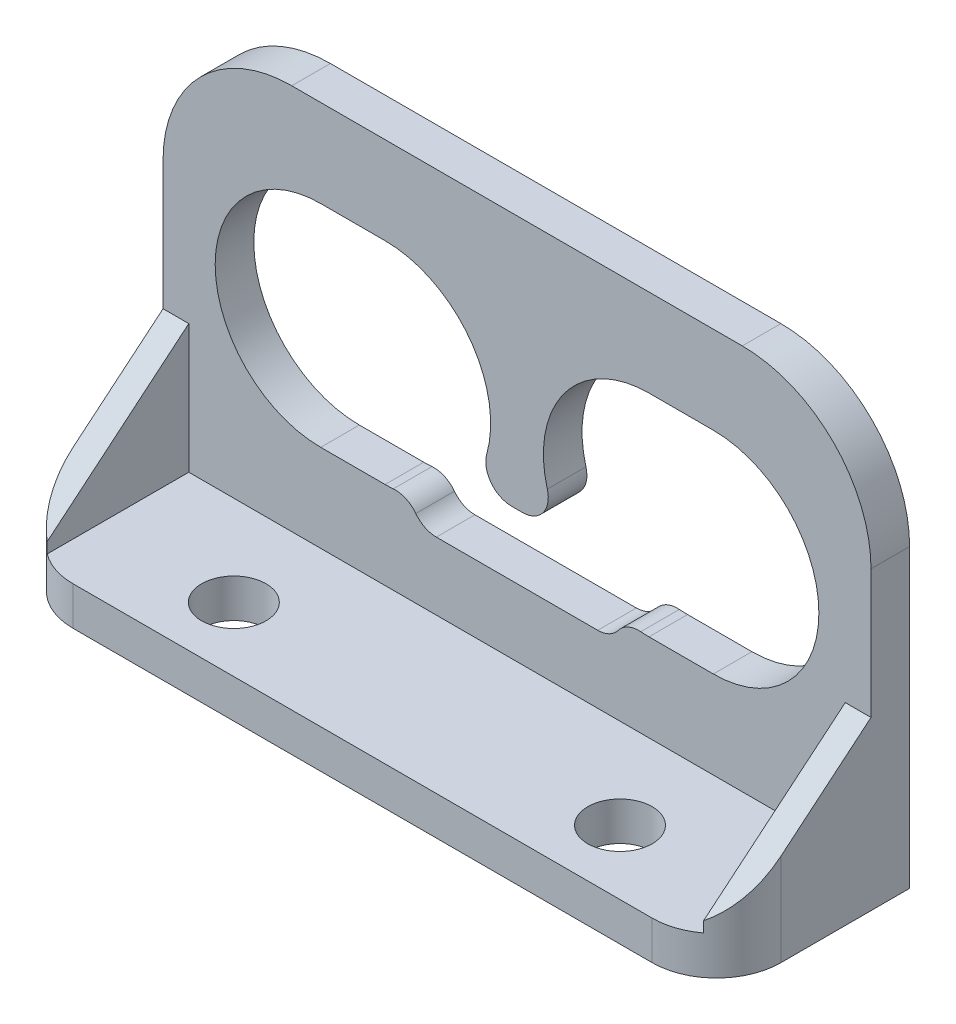
ISO-10303-21;
HEADER;
FILE_DESCRIPTION(('STEP AP214'),'2;1');
FILE_NAME('part.step','',(''),(''),'','','');
FILE_SCHEMA(('AUTOMOTIVE_DESIGN { 1 0 10303 214 1 1 1 1 }'));
ENDSEC;
DATA;
#1=APPLICATION_CONTEXT('core data for automotive mechanical design processes');
#2=APPLICATION_PROTOCOL_DEFINITION('international standard','automotive_design',2000,#1);
#3=PRODUCT_CONTEXT('',#1,'mechanical');
#4=PRODUCT('Part','Part','',(#3));
#5=PRODUCT_RELATED_PRODUCT_CATEGORY('part','',(#4));
#6=PRODUCT_DEFINITION_FORMATION('','',#4);
#7=PRODUCT_DEFINITION_CONTEXT('part definition',#1,'design');
#8=PRODUCT_DEFINITION('design','',#6,#7);
#9=PRODUCT_DEFINITION_SHAPE('','',#8);
#10=(LENGTH_UNIT() NAMED_UNIT(*) SI_UNIT(.MILLI.,.METRE.));
#11=(NAMED_UNIT(*) PLANE_ANGLE_UNIT() SI_UNIT($,.RADIAN.));
#12=(NAMED_UNIT(*) SI_UNIT($,.STERADIAN.) SOLID_ANGLE_UNIT());
#13=UNCERTAINTY_MEASURE_WITH_UNIT(LENGTH_MEASURE(1.E-05),#10,'distance_accuracy_value','');
#14=(GEOMETRIC_REPRESENTATION_CONTEXT(3) GLOBAL_UNCERTAINTY_ASSIGNED_CONTEXT((#13)) GLOBAL_UNIT_ASSIGNED_CONTEXT((#10,
#11,#12)) REPRESENTATION_CONTEXT('',''));
#15=CARTESIAN_POINT('',(0.,0.,0.));
#16=DIRECTION('',(0.,0.,1.));
#17=DIRECTION('',(1.,0.,0.));
#18=AXIS2_PLACEMENT_3D('',#15,#16,#17);
#19=CARTESIAN_POINT('',(10.25,18.,-34.5));
#20=DIRECTION('',(0.,0.,1.));
#21=DIRECTION('',(1.,0.,0.));
#22=AXIS2_PLACEMENT_3D('',#19,#20,#21);
#23=CYLINDRICAL_SURFACE('',#22,8.2);
#24=CARTESIAN_POINT('',(10.25,18.,-7.5));
#25=DIRECTION('',(0.,0.,1.));
#26=DIRECTION('',(1.,0.,0.));
#27=AXIS2_PLACEMENT_3D('',#24,#25,#26);
#28=CIRCLE('',#27,8.2);
#29=CARTESIAN_POINT('',(9.61137531752582,9.82490620757567,-7.5));
#30=VERTEX_POINT('',#29);
#31=CARTESIAN_POINT('',(10.25,9.8,-7.5));
#32=VERTEX_POINT('',#31);
#33=EDGE_CURVE('E510',#30,#32,#28,.T.);
#34=ORIENTED_EDGE('',*,*,#33,.F.);
#35=DIRECTION('',(0.,0.,1.));
#36=VECTOR('',#35,1.);
#37=CARTESIAN_POINT('',(9.61137531752582,9.82490620757567,-34.5));
#38=LINE('',#37,#36);
#39=CARTESIAN_POINT('',(9.61137531752582,9.82490620757567,-4.5));
#40=VERTEX_POINT('',#39);
#41=EDGE_CURVE('E342',#30,#40,#38,.T.);
#42=ORIENTED_EDGE('',*,*,#41,.T.);
#43=CARTESIAN_POINT('',(10.25,18.,-4.5));
#44=DIRECTION('',(0.,0.,1.));
#45=DIRECTION('',(-1.,0.,0.));
#46=AXIS2_PLACEMENT_3D('',#43,#44,#45);
#47=CIRCLE('',#46,8.2);
#48=CARTESIAN_POINT('',(10.25,9.8,-4.5));
#49=VERTEX_POINT('',#48);
#50=EDGE_CURVE('E492',#40,#49,#47,.T.);
#51=ORIENTED_EDGE('',*,*,#50,.T.);
#52=DIRECTION('',(0.,0.,1.));
#53=VECTOR('',#52,1.);
#54=CARTESIAN_POINT('',(10.25,9.8,-34.5));
#55=LINE('',#54,#53);
#56=EDGE_CURVE('E501',#32,#49,#55,.T.);
#57=ORIENTED_EDGE('',*,*,#56,.F.);
#58=EDGE_LOOP('',(#34,#42,#51,#57));
#59=FACE_BOUND('',#58,.T.);
#60=ADVANCED_FACE('F33',(#59),#23,.F.);
#61=CARTESIAN_POINT('',(-10.25,18.,-34.5));
#62=DIRECTION('',(0.,0.,1.));
#63=DIRECTION('',(1.,0.,0.));
#64=AXIS2_PLACEMENT_3D('',#61,#62,#63);
#65=CYLINDRICAL_SURFACE('',#64,8.2);
#66=CARTESIAN_POINT('',(-10.25,18.,-4.5));
#67=DIRECTION('',(0.,0.,1.));
#68=DIRECTION('',(1.,0.,0.));
#69=AXIS2_PLACEMENT_3D('',#66,#67,#68);
#70=CIRCLE('',#69,8.2);
#71=CARTESIAN_POINT('',(-10.25,9.8,-4.5));
#72=VERTEX_POINT('',#71);
#73=CARTESIAN_POINT('',(-9.61137531752582,9.82490620757567,-4.5));
#74=VERTEX_POINT('',#73);
#75=EDGE_CURVE('E471',#72,#74,#70,.T.);
#76=ORIENTED_EDGE('',*,*,#75,.T.);
#77=DIRECTION('',(0.,0.,1.));
#78=VECTOR('',#77,1.);
#79=CARTESIAN_POINT('',(-9.61137531752582,9.82490620757567,-34.5));
#80=LINE('',#79,#78);
#81=CARTESIAN_POINT('',(-9.61137531752582,9.82490620757567,-7.5));
#82=VERTEX_POINT('',#81);
#83=EDGE_CURVE('E329',#74,#82,#80,.F.);
#84=ORIENTED_EDGE('',*,*,#83,.T.);
#85=CARTESIAN_POINT('',(-10.25,18.,-7.5));
#86=DIRECTION('',(0.,0.,1.));
#87=DIRECTION('',(1.,0.,0.));
#88=AXIS2_PLACEMENT_3D('',#85,#86,#87);
#89=CIRCLE('',#88,8.2);
#90=CARTESIAN_POINT('',(-10.25,9.8,-7.5));
#91=VERTEX_POINT('',#90);
#92=EDGE_CURVE('E524',#91,#82,#89,.T.);
#93=ORIENTED_EDGE('',*,*,#92,.F.);
#94=DIRECTION('',(0.,0.,1.));
#95=VECTOR('',#94,1.);
#96=CARTESIAN_POINT('',(-10.25,9.8,-34.5));
#97=LINE('',#96,#95);
#98=EDGE_CURVE('E484',#91,#72,#97,.T.);
#99=ORIENTED_EDGE('',*,*,#98,.T.);
#100=EDGE_LOOP('',(#76,#84,#93,#99));
#101=FACE_BOUND('',#100,.T.);
#102=ADVANCED_FACE('F553',(#101),#65,.F.);
#103=CARTESIAN_POINT('',(0.,3.,0.));
#104=DIRECTION('',(0.,1.,0.));
#105=DIRECTION('',(0.,0.,1.));
#106=AXIS2_PLACEMENT_3D('',#103,#104,#105);
#107=PLANE('',#106);
#108=CARTESIAN_POINT('',(-15.,3.,2.5));
#109=DIRECTION('',(0.,1.,0.));
#110=DIRECTION('',(0.,0.,1.));
#111=AXIS2_PLACEMENT_3D('',#108,#109,#110);
#112=CIRCLE('',#111,2.5);
#113=CARTESIAN_POINT('',(-15.,3.,5.));
#114=VERTEX_POINT('',#113);
#115=EDGE_CURVE('E308',#114,#114,#112,.T.);
#116=ORIENTED_EDGE('',*,*,#115,.F.);
#117=EDGE_LOOP('',(#116));
#118=FACE_BOUND('',#117,.T.);
#119=CARTESIAN_POINT('',(15.,3.,2.5));
#120=DIRECTION('',(0.,1.,0.));
#121=DIRECTION('',(0.,0.,-1.));
#122=AXIS2_PLACEMENT_3D('',#119,#120,#121);
#123=CIRCLE('',#122,2.5);
#124=CARTESIAN_POINT('',(15.,3.,0.));
#125=VERTEX_POINT('',#124);
#126=EDGE_CURVE('E459',#125,#125,#123,.T.);
#127=ORIENTED_EDGE('',*,*,#126,.F.);
#128=EDGE_LOOP('',(#127));
#129=FACE_BOUND('',#128,.T.);
#130=DIRECTION('',(1.,0.,0.));
#131=VECTOR('',#130,1.);
#132=CARTESIAN_POINT('',(27.5,3.,7.49999999999999));
#133=LINE('',#132,#131);
#134=CARTESIAN_POINT('',(-22.5,3.,7.5));
#135=VERTEX_POINT('',#134);
#136=CARTESIAN_POINT('',(22.5,3.,7.5));
#137=VERTEX_POINT('',#136);
#138=EDGE_CURVE('E287',#135,#137,#133,.T.);
#139=ORIENTED_EDGE('',*,*,#138,.T.);
#140=CARTESIAN_POINT('',(22.5,3.,2.5));
#141=DIRECTION('',(0.,1.,0.));
#142=DIRECTION('',(0.,0.,1.));
#143=AXIS2_PLACEMENT_3D('',#140,#141,#142);
#144=CIRCLE('',#143,5.);
#145=CARTESIAN_POINT('',(25.5,3.,6.49999999999998));
#146=VERTEX_POINT('',#145);
#147=EDGE_CURVE('E262',#137,#146,#144,.T.);
#148=ORIENTED_EDGE('',*,*,#147,.T.);
#149=DIRECTION('',(0.,0.,1.));
#150=VECTOR('',#149,1.);
#151=CARTESIAN_POINT('',(25.5,3.,7.5));
#152=LINE('',#151,#150);
#153=CARTESIAN_POINT('',(25.5,3.,-4.5));
#154=VERTEX_POINT('',#153);
#155=EDGE_CURVE('E244',#154,#146,#152,.T.);
#156=ORIENTED_EDGE('',*,*,#155,.F.);
#157=DIRECTION('',(1.,0.,0.));
#158=VECTOR('',#157,1.);
#159=CARTESIAN_POINT('',(-27.5,3.,-4.5));
#160=LINE('',#159,#158);
#161=CARTESIAN_POINT('',(-25.5,3.,-4.5));
#162=VERTEX_POINT('',#161);
#163=EDGE_CURVE('E259',#162,#154,#160,.T.);
#164=ORIENTED_EDGE('',*,*,#163,.F.);
#165=DIRECTION('',(0.,0.,1.));
#166=VECTOR('',#165,1.);
#167=CARTESIAN_POINT('',(-25.5,3.,7.5));
#168=LINE('',#167,#166);
#169=CARTESIAN_POINT('',(-25.5,3.,6.5));
#170=VERTEX_POINT('',#169);
#171=EDGE_CURVE('E455',#162,#170,#168,.T.);
#172=ORIENTED_EDGE('',*,*,#171,.T.);
#173=CARTESIAN_POINT('',(-22.5,3.,2.5));
#174=DIRECTION('',(0.,1.,0.));
#175=DIRECTION('',(0.,0.,1.));
#176=AXIS2_PLACEMENT_3D('',#173,#174,#175);
#177=CIRCLE('',#176,5.);
#178=EDGE_CURVE('E393',#170,#135,#177,.T.);
#179=ORIENTED_EDGE('',*,*,#178,.T.);
#180=EDGE_LOOP('',(#139,#148,#156,#164,#172,#179));
#181=FACE_BOUND('',#180,.T.);
#182=ADVANCED_FACE('F257',(#118,#129,#181),#107,.T.);
#183=CARTESIAN_POINT('',(-27.5,33.,-4.5));
#184=DIRECTION('',(0.,0.,-1.));
#185=DIRECTION('',(-1.,0.,0.));
#186=AXIS2_PLACEMENT_3D('',#183,#184,#185);
#187=PLANE('',#186);
#188=DIRECTION('',(1.,0.,0.));
#189=VECTOR('',#188,1.);
#190=CARTESIAN_POINT('',(-27.5,13.25,-4.5));
#191=LINE('',#190,#189);
#192=CARTESIAN_POINT('',(-0.427703934415335,13.25,-4.5));
#193=VERTEX_POINT('',#192);
#194=CARTESIAN_POINT('',(0.427703934415335,13.25,-4.5));
#195=VERTEX_POINT('',#194);
#196=EDGE_CURVE('E571',#193,#195,#191,.T.);
#197=ORIENTED_EDGE('',*,*,#196,.T.);
#198=CARTESIAN_POINT('',(0.427703934415333,15.25,-4.5));
#199=DIRECTION('',(0.,0.,-1.));
#200=DIRECTION('',(-1.,0.,0.));
#201=AXIS2_PLACEMENT_3D('',#198,#199,#200);
#202=CIRCLE('',#201,2.);
#203=CARTESIAN_POINT('',(2.35364433943193,15.7892156862745,-4.5));
#204=VERTEX_POINT('',#203);
#205=EDGE_CURVE('E358',#195,#204,#202,.F.);
#206=ORIENTED_EDGE('',*,*,#205,.T.);
#207=CARTESIAN_POINT('',(10.25,26.2,-4.5));
#208=VERTEX_POINT('',#207);
#209=EDGE_CURVE('E493',#208,#204,#47,.T.);
#210=ORIENTED_EDGE('',*,*,#209,.F.);
#211=DIRECTION('',(-1.,0.,0.));
#212=VECTOR('',#211,1.);
#213=CARTESIAN_POINT('',(15.25,26.2,-4.5));
#214=LINE('',#213,#212);
#215=CARTESIAN_POINT('',(15.25,26.2,-4.5));
#216=VERTEX_POINT('',#215);
#217=EDGE_CURVE('E489',#216,#208,#214,.T.);
#218=ORIENTED_EDGE('',*,*,#217,.F.);
#219=CARTESIAN_POINT('',(15.25,18.,-4.5));
#220=DIRECTION('',(0.,0.,1.));
#221=DIRECTION('',(-1.,0.,0.));
#222=AXIS2_PLACEMENT_3D('',#219,#220,#221);
#223=CIRCLE('',#222,8.2);
#224=CARTESIAN_POINT('',(15.25,9.8,-4.5));
#225=VERTEX_POINT('',#224);
#226=EDGE_CURVE('E311',#225,#216,#223,.T.);
#227=ORIENTED_EDGE('',*,*,#226,.F.);
#228=DIRECTION('',(1.,0.,0.));
#229=VECTOR('',#228,1.);
#230=CARTESIAN_POINT('',(15.25,9.8,-4.5));
#231=LINE('',#230,#229);
#232=EDGE_CURVE('E496',#49,#225,#231,.T.);
#233=ORIENTED_EDGE('',*,*,#232,.F.);
#234=ORIENTED_EDGE('',*,*,#50,.F.);
#235=CARTESIAN_POINT('',(9.45561319984919,7.83098089235023,-4.5));
#236=DIRECTION('',(0.,0.,-1.));
#237=DIRECTION('',(-1.,0.,0.));
#238=AXIS2_PLACEMENT_3D('',#235,#236,#237);
#239=CIRCLE('',#238,2.);
#240=CARTESIAN_POINT('',(7.86278971960842,9.04049044617512,-4.5));
#241=VERTEX_POINT('',#240);
#242=EDGE_CURVE('E337',#40,#241,#239,.F.);
#243=ORIENTED_EDGE('',*,*,#242,.T.);
#244=CARTESIAN_POINT('',(6.26996623936765,10.25,-4.5));
#245=DIRECTION('',(0.,0.,-1.));
#246=DIRECTION('',(-1.,0.,0.));
#247=AXIS2_PLACEMENT_3D('',#244,#245,#246);
#248=CIRCLE('',#247,2.);
#249=CARTESIAN_POINT('',(6.26996623936765,8.25000000000001,-4.5));
#250=VERTEX_POINT('',#249);
#251=EDGE_CURVE('E379',#241,#250,#248,.T.);
#252=ORIENTED_EDGE('',*,*,#251,.T.);
#253=DIRECTION('',(-1.,0.,0.));
#254=VECTOR('',#253,1.);
#255=CARTESIAN_POINT('',(-27.5,8.25000000000001,-4.5));
#256=LINE('',#255,#254);
#257=CARTESIAN_POINT('',(-6.26996623936765,8.25000000000001,-4.5));
#258=VERTEX_POINT('',#257);
#259=EDGE_CURVE('E410',#250,#258,#256,.T.);
#260=ORIENTED_EDGE('',*,*,#259,.T.);
#261=CARTESIAN_POINT('',(-6.26996623936765,10.25,-4.5));
#262=DIRECTION('',(0.,0.,-1.));
#263=DIRECTION('',(-1.,0.,0.));
#264=AXIS2_PLACEMENT_3D('',#261,#262,#263);
#265=CIRCLE('',#264,2.);
#266=CARTESIAN_POINT('',(-7.86278971960842,9.04049044617512,-4.5));
#267=VERTEX_POINT('',#266);
#268=EDGE_CURVE('E375',#258,#267,#265,.T.);
#269=ORIENTED_EDGE('',*,*,#268,.T.);
#270=CARTESIAN_POINT('',(-9.45561319984919,7.83098089235023,-4.5));
#271=DIRECTION('',(0.,0.,-1.));
#272=DIRECTION('',(-1.,0.,0.));
#273=AXIS2_PLACEMENT_3D('',#270,#271,#272);
#274=CIRCLE('',#273,2.);
#275=EDGE_CURVE('E340',#267,#74,#274,.F.);
#276=ORIENTED_EDGE('',*,*,#275,.T.);
#277=ORIENTED_EDGE('',*,*,#75,.F.);
#278=DIRECTION('',(1.,0.,0.));
#279=VECTOR('',#278,1.);
#280=CARTESIAN_POINT('',(-15.25,9.8,-4.5));
#281=LINE('',#280,#279);
#282=CARTESIAN_POINT('',(-15.25,9.8,-4.5));
#283=VERTEX_POINT('',#282);
#284=EDGE_CURVE('E466',#283,#72,#281,.T.);
#285=ORIENTED_EDGE('',*,*,#284,.F.);
#286=CARTESIAN_POINT('',(-15.25,18.,-4.5));
#287=DIRECTION('',(0.,0.,1.));
#288=DIRECTION('',(1.,0.,0.));
#289=AXIS2_PLACEMENT_3D('',#286,#287,#288);
#290=CIRCLE('',#289,8.2);
#291=CARTESIAN_POINT('',(-15.25,26.2,-4.5));
#292=VERTEX_POINT('',#291);
#293=EDGE_CURVE('E464',#292,#283,#290,.T.);
#294=ORIENTED_EDGE('',*,*,#293,.F.);
#295=DIRECTION('',(-1.,0.,0.));
#296=VECTOR('',#295,1.);
#297=CARTESIAN_POINT('',(-15.25,26.2,-4.5));
#298=LINE('',#297,#296);
#299=CARTESIAN_POINT('',(-10.25,26.2,-4.5));
#300=VERTEX_POINT('',#299);
#301=EDGE_CURVE('E474',#300,#292,#298,.T.);
#302=ORIENTED_EDGE('',*,*,#301,.F.);
#303=CARTESIAN_POINT('',(-2.35364433943193,15.7892156862745,-4.5));
#304=VERTEX_POINT('',#303);
#305=EDGE_CURVE('E470',#304,#300,#70,.T.);
#306=ORIENTED_EDGE('',*,*,#305,.F.);
#307=CARTESIAN_POINT('',(-0.427703934415333,15.25,-4.5));
#308=DIRECTION('',(0.,0.,-1.));
#309=DIRECTION('',(-1.,0.,0.));
#310=AXIS2_PLACEMENT_3D('',#307,#308,#309);
#311=CIRCLE('',#310,2.);
#312=EDGE_CURVE('E356',#304,#193,#311,.F.);
#313=ORIENTED_EDGE('',*,*,#312,.T.);
#314=EDGE_LOOP('',(#197,#206,#210,#218,#227,#233,#234,#243,#252,#260,#269,#276,#277,#285,#294,
#302,#306,#313));
#315=FACE_BOUND('',#314,.T.);
#316=DIRECTION('',(0.,-1.,0.));
#317=VECTOR('',#316,1.);
#318=CARTESIAN_POINT('',(27.5,33.,-4.5));
#319=LINE('',#318,#317);
#320=CARTESIAN_POINT('',(27.5,23.,-4.5));
#321=VERTEX_POINT('',#320);
#322=CARTESIAN_POINT('',(27.5,13.,-4.5));
#323=VERTEX_POINT('',#322);
#324=EDGE_CURVE('E280',#321,#323,#319,.T.);
#325=ORIENTED_EDGE('',*,*,#324,.F.);
#326=CARTESIAN_POINT('',(17.5,23.,-4.5));
#327=DIRECTION('',(0.,0.,-1.));
#328=DIRECTION('',(-1.,0.,0.));
#329=AXIS2_PLACEMENT_3D('',#326,#327,#328);
#330=CIRCLE('',#329,10.);
#331=CARTESIAN_POINT('',(17.5,33.,-4.5));
#332=VERTEX_POINT('',#331);
#333=EDGE_CURVE('E325',#321,#332,#330,.F.);
#334=ORIENTED_EDGE('',*,*,#333,.T.);
#335=DIRECTION('',(1.,0.,0.));
#336=VECTOR('',#335,1.);
#337=CARTESIAN_POINT('',(-27.5,33.,-4.5));
#338=LINE('',#337,#336);
#339=CARTESIAN_POINT('',(-17.5,33.,-4.5));
#340=VERTEX_POINT('',#339);
#341=EDGE_CURVE('E269',#340,#332,#338,.T.);
#342=ORIENTED_EDGE('',*,*,#341,.F.);
#343=CARTESIAN_POINT('',(-17.5,23.,-4.5));
#344=DIRECTION('',(0.,0.,-1.));
#345=DIRECTION('',(-1.,0.,0.));
#346=AXIS2_PLACEMENT_3D('',#343,#344,#345);
#347=CIRCLE('',#346,10.);
#348=CARTESIAN_POINT('',(-27.5,23.,-4.5));
#349=VERTEX_POINT('',#348);
#350=EDGE_CURVE('E323',#340,#349,#347,.F.);
#351=ORIENTED_EDGE('',*,*,#350,.T.);
#352=DIRECTION('',(0.,-1.,0.));
#353=VECTOR('',#352,1.);
#354=CARTESIAN_POINT('',(-27.5,33.,-4.5));
#355=LINE('',#354,#353);
#356=CARTESIAN_POINT('',(-27.5,13.,-4.5));
#357=VERTEX_POINT('',#356);
#358=EDGE_CURVE('E283',#349,#357,#355,.T.);
#359=ORIENTED_EDGE('',*,*,#358,.T.);
#360=DIRECTION('',(-1.,0.,0.));
#361=VECTOR('',#360,1.);
#362=CARTESIAN_POINT('',(-25.5,13.,-4.5));
#363=LINE('',#362,#361);
#364=CARTESIAN_POINT('',(-25.5,13.,-4.5));
#365=VERTEX_POINT('',#364);
#366=EDGE_CURVE('E457',#365,#357,#363,.T.);
#367=ORIENTED_EDGE('',*,*,#366,.F.);
#368=DIRECTION('',(0.,-1.,0.));
#369=VECTOR('',#368,1.);
#370=CARTESIAN_POINT('',(-25.5,3.,-4.5));
#371=LINE('',#370,#369);
#372=EDGE_CURVE('E268',#365,#162,#371,.T.);
#373=ORIENTED_EDGE('',*,*,#372,.T.);
#374=ORIENTED_EDGE('',*,*,#163,.T.);
#375=DIRECTION('',(0.,-1.,0.));
#376=VECTOR('',#375,1.);
#377=CARTESIAN_POINT('',(25.5,3.,-4.5));
#378=LINE('',#377,#376);
#379=CARTESIAN_POINT('',(25.5,13.,-4.5));
#380=VERTEX_POINT('',#379);
#381=EDGE_CURVE('E241',#380,#154,#378,.T.);
#382=ORIENTED_EDGE('',*,*,#381,.F.);
#383=DIRECTION('',(1.,0.,0.));
#384=VECTOR('',#383,1.);
#385=CARTESIAN_POINT('',(25.5,13.,-4.5));
#386=LINE('',#385,#384);
#387=EDGE_CURVE('E252',#380,#323,#386,.T.);
#388=ORIENTED_EDGE('',*,*,#387,.T.);
#389=EDGE_LOOP('',(#325,#334,#342,#351,#359,#367,#373,#374,#382,#388));
#390=FACE_BOUND('',#389,.T.);
#391=ADVANCED_FACE('F265',(#315,#390),#187,.F.);
#392=CARTESIAN_POINT('',(-27.5,3.,7.5));
#393=DIRECTION('',(1.,0.,0.));
#394=DIRECTION('',(0.,0.,-1.));
#395=AXIS2_PLACEMENT_3D('',#392,#393,#394);
#396=PLANE('',#395);
#397=DIRECTION('',(0.,0.,1.));
#398=VECTOR('',#397,1.);
#399=CARTESIAN_POINT('',(-27.5,0.,7.5));
#400=LINE('',#399,#398);
#401=CARTESIAN_POINT('',(-27.5,0.,-7.5));
#402=VERTEX_POINT('',#401);
#403=CARTESIAN_POINT('',(-27.5,0.,2.5));
#404=VERTEX_POINT('',#403);
#405=EDGE_CURVE('E286',#402,#404,#400,.T.);
#406=ORIENTED_EDGE('',*,*,#405,.T.);
#407=DIRECTION('',(0.,-1.,0.));
#408=VECTOR('',#407,1.);
#409=CARTESIAN_POINT('',(-27.5,3.,2.5));
#410=LINE('',#409,#408);
#411=CARTESIAN_POINT('',(-27.5,7.16666666666667,2.5));
#412=VERTEX_POINT('',#411);
#413=EDGE_CURVE('E55',#404,#412,#410,.F.);
#414=ORIENTED_EDGE('',*,*,#413,.T.);
#415=DIRECTION('',(0.,0.64018439966448,-0.768221279597376));
#416=VECTOR('',#415,1.);
#417=CARTESIAN_POINT('',(-27.5,13.,-4.5));
#418=LINE('',#417,#416);
#419=EDGE_CURVE('E448',#412,#357,#418,.T.);
#420=ORIENTED_EDGE('',*,*,#419,.T.);
#421=ORIENTED_EDGE('',*,*,#358,.F.);
#422=DIRECTION('',(0.,0.,1.));
#423=VECTOR('',#422,1.);
#424=CARTESIAN_POINT('',(-27.5,23.,-7.5));
#425=LINE('',#424,#423);
#426=CARTESIAN_POINT('',(-27.5,23.,-7.5));
#427=VERTEX_POINT('',#426);
#428=EDGE_CURVE('E327',#349,#427,#425,.F.);
#429=ORIENTED_EDGE('',*,*,#428,.T.);
#430=DIRECTION('',(0.,-1.,0.));
#431=VECTOR('',#430,1.);
#432=CARTESIAN_POINT('',(-27.5,3.,-7.5));
#433=LINE('',#432,#431);
#434=EDGE_CURVE('E289',#427,#402,#433,.T.);
#435=ORIENTED_EDGE('',*,*,#434,.T.);
#436=EDGE_LOOP('',(#406,#414,#420,#421,#429,#435));
#437=FACE_BOUND('',#436,.T.);
#438=ADVANCED_FACE('F426',(#437),#396,.F.);
#439=CARTESIAN_POINT('',(27.5,3.,7.49999999999999));
#440=DIRECTION('',(0.,0.,-1.));
#441=DIRECTION('',(-1.,0.,0.));
#442=AXIS2_PLACEMENT_3D('',#439,#440,#441);
#443=PLANE('',#442);
#444=DIRECTION('',(1.,0.,0.));
#445=VECTOR('',#444,1.);
#446=CARTESIAN_POINT('',(27.5,0.,7.49999999999999));
#447=LINE('',#446,#445);
#448=CARTESIAN_POINT('',(-22.5,0.,7.5));
#449=VERTEX_POINT('',#448);
#450=CARTESIAN_POINT('',(22.5,0.,7.5));
#451=VERTEX_POINT('',#450);
#452=EDGE_CURVE('E292',#449,#451,#447,.T.);
#453=ORIENTED_EDGE('',*,*,#452,.T.);
#454=DIRECTION('',(0.,-1.,0.));
#455=VECTOR('',#454,1.);
#456=CARTESIAN_POINT('',(22.5,3.,7.5));
#457=LINE('',#456,#455);
#458=EDGE_CURVE('E391',#451,#137,#457,.F.);
#459=ORIENTED_EDGE('',*,*,#458,.T.);
#460=ORIENTED_EDGE('',*,*,#138,.F.);
#461=DIRECTION('',(0.,-1.,0.));
#462=VECTOR('',#461,1.);
#463=CARTESIAN_POINT('',(-22.5,3.,7.5));
#464=LINE('',#463,#462);
#465=EDGE_CURVE('E388',#135,#449,#464,.T.);
#466=ORIENTED_EDGE('',*,*,#465,.T.);
#467=EDGE_LOOP('',(#453,#459,#460,#466));
#468=FACE_BOUND('',#467,.T.);
#469=ADVANCED_FACE('F419',(#468),#443,.F.);
#470=CARTESIAN_POINT('',(27.5,3.,7.49999999999999));
#471=DIRECTION('',(-1.,0.,0.));
#472=DIRECTION('',(0.,0.,1.));
#473=AXIS2_PLACEMENT_3D('',#470,#471,#472);
#474=PLANE('',#473);
#475=DIRECTION('',(0.,0.64018439966448,-0.768221279597376));
#476=VECTOR('',#475,1.);
#477=CARTESIAN_POINT('',(27.5,13.,-4.5));
#478=LINE('',#477,#476);
#479=CARTESIAN_POINT('',(27.5,7.16666666666667,2.5));
#480=VERTEX_POINT('',#479);
#481=EDGE_CURVE('E404',#480,#323,#478,.T.);
#482=ORIENTED_EDGE('',*,*,#481,.F.);
#483=DIRECTION('',(0.,-1.,0.));
#484=VECTOR('',#483,1.);
#485=CARTESIAN_POINT('',(27.5,3.,2.5));
#486=LINE('',#485,#484);
#487=CARTESIAN_POINT('',(27.5,0.,2.5));
#488=VERTEX_POINT('',#487);
#489=EDGE_CURVE('E381',#480,#488,#486,.T.);
#490=ORIENTED_EDGE('',*,*,#489,.T.);
#491=DIRECTION('',(0.,0.,-1.));
#492=VECTOR('',#491,1.);
#493=CARTESIAN_POINT('',(27.5,0.,7.49999999999999));
#494=LINE('',#493,#492);
#495=CARTESIAN_POINT('',(27.5,0.,-7.50000000000001));
#496=VERTEX_POINT('',#495);
#497=EDGE_CURVE('E295',#488,#496,#494,.T.);
#498=ORIENTED_EDGE('',*,*,#497,.T.);
#499=DIRECTION('',(0.,-1.,0.));
#500=VECTOR('',#499,1.);
#501=CARTESIAN_POINT('',(27.5,3.,-7.50000000000001));
#502=LINE('',#501,#500);
#503=CARTESIAN_POINT('',(27.5,23.,-7.50000000000001));
#504=VERTEX_POINT('',#503);
#505=EDGE_CURVE('E300',#504,#496,#502,.T.);
#506=ORIENTED_EDGE('',*,*,#505,.F.);
#507=DIRECTION('',(0.,0.,-1.));
#508=VECTOR('',#507,1.);
#509=CARTESIAN_POINT('',(27.5,23.,-4.5));
#510=LINE('',#509,#508);
#511=EDGE_CURVE('E321',#504,#321,#510,.F.);
#512=ORIENTED_EDGE('',*,*,#511,.T.);
#513=ORIENTED_EDGE('',*,*,#324,.T.);
#514=EDGE_LOOP('',(#482,#490,#498,#506,#512,#513));
#515=FACE_BOUND('',#514,.T.);
#516=ADVANCED_FACE('F408',(#515),#474,.F.);
#517=CARTESIAN_POINT('',(27.5,3.,-7.50000000000001));
#518=DIRECTION('',(0.,0.,1.));
#519=DIRECTION('',(1.,0.,0.));
#520=AXIS2_PLACEMENT_3D('',#517,#518,#519);
#521=PLANE('',#520);
#522=CARTESIAN_POINT('',(10.25,26.2,-7.5));
#523=VERTEX_POINT('',#522);
#524=CARTESIAN_POINT('',(2.35364433943193,15.7892156862745,-7.5));
#525=VERTEX_POINT('',#524);
#526=EDGE_CURVE('E511',#523,#525,#28,.T.);
#527=ORIENTED_EDGE('',*,*,#526,.T.);
#528=CARTESIAN_POINT('',(0.427703934415333,15.25,-7.5));
#529=DIRECTION('',(0.,0.,1.));
#530=DIRECTION('',(1.,0.,0.));
#531=AXIS2_PLACEMENT_3D('',#528,#529,#530);
#532=CIRCLE('',#531,2.);
#533=CARTESIAN_POINT('',(0.427703934415332,13.25,-7.5));
#534=VERTEX_POINT('',#533);
#535=EDGE_CURVE('E350',#525,#534,#532,.F.);
#536=ORIENTED_EDGE('',*,*,#535,.T.);
#537=DIRECTION('',(1.,0.,0.));
#538=VECTOR('',#537,1.);
#539=CARTESIAN_POINT('',(-7.5,13.25,-7.5));
#540=LINE('',#539,#538);
#541=CARTESIAN_POINT('',(-0.427703934415333,13.25,-7.5));
#542=VERTEX_POINT('',#541);
#543=EDGE_CURVE('E572',#542,#534,#540,.T.);
#544=ORIENTED_EDGE('',*,*,#543,.F.);
#545=CARTESIAN_POINT('',(-0.427703934415333,15.25,-7.5));
#546=DIRECTION('',(0.,0.,1.));
#547=DIRECTION('',(1.,0.,0.));
#548=AXIS2_PLACEMENT_3D('',#545,#546,#547);
#549=CIRCLE('',#548,2.);
#550=CARTESIAN_POINT('',(-2.35364433943193,15.7892156862745,-7.5));
#551=VERTEX_POINT('',#550);
#552=EDGE_CURVE('E348',#542,#551,#549,.F.);
#553=ORIENTED_EDGE('',*,*,#552,.T.);
#554=CARTESIAN_POINT('',(-10.25,26.2,-7.5));
#555=VERTEX_POINT('',#554);
#556=EDGE_CURVE('E523',#551,#555,#89,.T.);
#557=ORIENTED_EDGE('',*,*,#556,.T.);
#558=DIRECTION('',(-1.,0.,0.));
#559=VECTOR('',#558,1.);
#560=CARTESIAN_POINT('',(27.5,26.2,-7.50000000000001));
#561=LINE('',#560,#559);
#562=CARTESIAN_POINT('',(-15.25,26.2,-7.5));
#563=VERTEX_POINT('',#562);
#564=EDGE_CURVE('E276',#555,#563,#561,.T.);
#565=ORIENTED_EDGE('',*,*,#564,.T.);
#566=CARTESIAN_POINT('',(-15.25,18.,-7.5));
#567=DIRECTION('',(0.,0.,1.));
#568=DIRECTION('',(1.,0.,0.));
#569=AXIS2_PLACEMENT_3D('',#566,#567,#568);
#570=CIRCLE('',#569,8.2);
#571=CARTESIAN_POINT('',(-15.25,9.8,-7.5));
#572=VERTEX_POINT('',#571);
#573=EDGE_CURVE('E270',#563,#572,#570,.T.);
#574=ORIENTED_EDGE('',*,*,#573,.T.);
#575=DIRECTION('',(1.,0.,0.));
#576=VECTOR('',#575,1.);
#577=CARTESIAN_POINT('',(27.5,9.8,-7.50000000000001));
#578=LINE('',#577,#576);
#579=EDGE_CURVE('E520',#572,#91,#578,.T.);
#580=ORIENTED_EDGE('',*,*,#579,.T.);
#581=ORIENTED_EDGE('',*,*,#92,.T.);
#582=CARTESIAN_POINT('',(-9.45561319984919,7.83098089235023,-7.5));
#583=DIRECTION('',(0.,0.,1.));
#584=DIRECTION('',(1.,0.,0.));
#585=AXIS2_PLACEMENT_3D('',#582,#583,#584);
#586=CIRCLE('',#585,2.);
#587=CARTESIAN_POINT('',(-7.86278971960842,9.04049044617512,-7.5));
#588=VERTEX_POINT('',#587);
#589=EDGE_CURVE('E334',#82,#588,#586,.F.);
#590=ORIENTED_EDGE('',*,*,#589,.T.);
#591=CARTESIAN_POINT('',(-6.26996623936765,10.25,-7.5));
#592=DIRECTION('',(0.,0.,1.));
#593=DIRECTION('',(1.,0.,0.));
#594=AXIS2_PLACEMENT_3D('',#591,#592,#593);
#595=CIRCLE('',#594,2.);
#596=CARTESIAN_POINT('',(-6.26996623936765,8.25000000000001,-7.5));
#597=VERTEX_POINT('',#596);
#598=EDGE_CURVE('E373',#588,#597,#595,.T.);
#599=ORIENTED_EDGE('',*,*,#598,.T.);
#600=DIRECTION('',(-1.,0.,0.));
#601=VECTOR('',#600,1.);
#602=CARTESIAN_POINT('',(-7.5,8.25000000000001,-7.5));
#603=LINE('',#602,#601);
#604=CARTESIAN_POINT('',(6.26996623936765,8.25,-7.5));
#605=VERTEX_POINT('',#604);
#606=EDGE_CURVE('E565',#605,#597,#603,.T.);
#607=ORIENTED_EDGE('',*,*,#606,.F.);
#608=CARTESIAN_POINT('',(6.26996623936765,10.25,-7.5));
#609=DIRECTION('',(0.,0.,1.));
#610=DIRECTION('',(1.,0.,0.));
#611=AXIS2_PLACEMENT_3D('',#608,#609,#610);
#612=CIRCLE('',#611,2.);
#613=CARTESIAN_POINT('',(7.86278971960842,9.04049044617512,-7.5));
#614=VERTEX_POINT('',#613);
#615=EDGE_CURVE('E377',#605,#614,#612,.T.);
#616=ORIENTED_EDGE('',*,*,#615,.T.);
#617=CARTESIAN_POINT('',(9.45561319984919,7.83098089235023,-7.5));
#618=DIRECTION('',(0.,0.,1.));
#619=DIRECTION('',(1.,0.,0.));
#620=AXIS2_PLACEMENT_3D('',#617,#618,#619);
#621=CIRCLE('',#620,2.);
#622=EDGE_CURVE('E332',#614,#30,#621,.F.);
#623=ORIENTED_EDGE('',*,*,#622,.T.);
#624=ORIENTED_EDGE('',*,*,#33,.T.);
#625=DIRECTION('',(1.,0.,0.));
#626=VECTOR('',#625,1.);
#627=CARTESIAN_POINT('',(27.5,9.8,-7.50000000000001));
#628=LINE('',#627,#626);
#629=CARTESIAN_POINT('',(15.25,9.8,-7.5));
#630=VERTEX_POINT('',#629);
#631=EDGE_CURVE('E514',#32,#630,#628,.T.);
#632=ORIENTED_EDGE('',*,*,#631,.T.);
#633=CARTESIAN_POINT('',(15.25,18.,-7.50000000000001));
#634=DIRECTION('',(0.,0.,1.));
#635=DIRECTION('',(1.,0.,0.));
#636=AXIS2_PLACEMENT_3D('',#633,#634,#635);
#637=CIRCLE('',#636,8.2);
#638=CARTESIAN_POINT('',(15.25,26.2,-7.5));
#639=VERTEX_POINT('',#638);
#640=EDGE_CURVE('E517',#630,#639,#637,.T.);
#641=ORIENTED_EDGE('',*,*,#640,.T.);
#642=DIRECTION('',(-1.,0.,0.));
#643=VECTOR('',#642,1.);
#644=CARTESIAN_POINT('',(27.5,26.2,-7.50000000000001));
#645=LINE('',#644,#643);
#646=EDGE_CURVE('E480',#639,#523,#645,.T.);
#647=ORIENTED_EDGE('',*,*,#646,.T.);
#648=EDGE_LOOP('',(#527,#536,#544,#553,#557,#565,#574,#580,#581,#590,#599,#607,#616,#623,#624,
#632,#641,#647));
#649=FACE_BOUND('',#648,.T.);
#650=DIRECTION('',(-1.,0.,0.));
#651=VECTOR('',#650,1.);
#652=CARTESIAN_POINT('',(-27.5,33.,-7.5));
#653=LINE('',#652,#651);
#654=CARTESIAN_POINT('',(17.5,33.,-7.5));
#655=VERTEX_POINT('',#654);
#656=CARTESIAN_POINT('',(-17.5,33.,-7.5));
#657=VERTEX_POINT('',#656);
#658=EDGE_CURVE('E273',#655,#657,#653,.T.);
#659=ORIENTED_EDGE('',*,*,#658,.F.);
#660=CARTESIAN_POINT('',(17.5,23.,-7.5));
#661=DIRECTION('',(0.,0.,1.));
#662=DIRECTION('',(1.,0.,0.));
#663=AXIS2_PLACEMENT_3D('',#660,#661,#662);
#664=CIRCLE('',#663,10.);
#665=EDGE_CURVE('E319',#655,#504,#664,.F.);
#666=ORIENTED_EDGE('',*,*,#665,.T.);
#667=ORIENTED_EDGE('',*,*,#505,.T.);
#668=DIRECTION('',(-1.,0.,0.));
#669=VECTOR('',#668,1.);
#670=CARTESIAN_POINT('',(27.5,0.,-7.50000000000001));
#671=LINE('',#670,#669);
#672=EDGE_CURVE('E290',#496,#402,#671,.T.);
#673=ORIENTED_EDGE('',*,*,#672,.T.);
#674=ORIENTED_EDGE('',*,*,#434,.F.);
#675=CARTESIAN_POINT('',(-17.5,23.,-7.5));
#676=DIRECTION('',(0.,0.,1.));
#677=DIRECTION('',(1.,0.,0.));
#678=AXIS2_PLACEMENT_3D('',#675,#676,#677);
#679=CIRCLE('',#678,10.);
#680=EDGE_CURVE('E317',#427,#657,#679,.F.);
#681=ORIENTED_EDGE('',*,*,#680,.T.);
#682=EDGE_LOOP('',(#659,#666,#667,#673,#674,#681));
#683=FACE_BOUND('',#682,.T.);
#684=ADVANCED_FACE('F433',(#649,#683),#521,.F.);
#685=CARTESIAN_POINT('',(0.,0.,0.));
#686=DIRECTION('',(0.,1.,0.));
#687=DIRECTION('',(0.,0.,1.));
#688=AXIS2_PLACEMENT_3D('',#685,#686,#687);
#689=PLANE('',#688);
#690=CARTESIAN_POINT('',(-15.,0.,2.5));
#691=DIRECTION('',(0.,1.,0.));
#692=DIRECTION('',(0.,0.,1.));
#693=AXIS2_PLACEMENT_3D('',#690,#691,#692);
#694=CIRCLE('',#693,2.5);
#695=CARTESIAN_POINT('',(-15.,0.,5.));
#696=VERTEX_POINT('',#695);
#697=EDGE_CURVE('E307',#696,#696,#694,.T.);
#698=ORIENTED_EDGE('',*,*,#697,.T.);
#699=EDGE_LOOP('',(#698));
#700=FACE_BOUND('',#699,.T.);
#701=CARTESIAN_POINT('',(15.,0.,2.5));
#702=DIRECTION('',(0.,1.,0.));
#703=DIRECTION('',(0.,0.,1.));
#704=AXIS2_PLACEMENT_3D('',#701,#702,#703);
#705=CIRCLE('',#704,2.5);
#706=CARTESIAN_POINT('',(15.,0.,5.));
#707=VERTEX_POINT('',#706);
#708=EDGE_CURVE('E304',#707,#707,#705,.T.);
#709=ORIENTED_EDGE('',*,*,#708,.T.);
#710=EDGE_LOOP('',(#709));
#711=FACE_BOUND('',#710,.T.);
#712=ORIENTED_EDGE('',*,*,#497,.F.);
#713=CARTESIAN_POINT('',(22.5,0.,2.5));
#714=DIRECTION('',(0.,1.,0.));
#715=DIRECTION('',(0.,0.,1.));
#716=AXIS2_PLACEMENT_3D('',#713,#714,#715);
#717=CIRCLE('',#716,5.);
#718=EDGE_CURVE('E386',#488,#451,#717,.F.);
#719=ORIENTED_EDGE('',*,*,#718,.T.);
#720=ORIENTED_EDGE('',*,*,#452,.F.);
#721=CARTESIAN_POINT('',(-22.5,0.,2.5));
#722=DIRECTION('',(0.,1.,0.));
#723=DIRECTION('',(0.,0.,1.));
#724=AXIS2_PLACEMENT_3D('',#721,#722,#723);
#725=CIRCLE('',#724,5.);
#726=EDGE_CURVE('E384',#449,#404,#725,.F.);
#727=ORIENTED_EDGE('',*,*,#726,.T.);
#728=ORIENTED_EDGE('',*,*,#405,.F.);
#729=ORIENTED_EDGE('',*,*,#672,.F.);
#730=EDGE_LOOP('',(#712,#719,#720,#727,#728,#729));
#731=FACE_BOUND('',#730,.T.);
#732=ADVANCED_FACE('F416',(#700,#711,#731),#689,.F.);
#733=CARTESIAN_POINT('',(0.,33.,0.));
#734=DIRECTION('',(0.,1.,0.));
#735=DIRECTION('',(0.,0.,1.));
#736=AXIS2_PLACEMENT_3D('',#733,#734,#735);
#737=PLANE('',#736);
#738=ORIENTED_EDGE('',*,*,#341,.T.);
#739=DIRECTION('',(0.,0.,-1.));
#740=VECTOR('',#739,1.);
#741=CARTESIAN_POINT('',(17.5,33.,-7.5));
#742=LINE('',#741,#740);
#743=EDGE_CURVE('E314',#332,#655,#742,.T.);
#744=ORIENTED_EDGE('',*,*,#743,.T.);
#745=ORIENTED_EDGE('',*,*,#658,.T.);
#746=DIRECTION('',(0.,0.,1.));
#747=VECTOR('',#746,1.);
#748=CARTESIAN_POINT('',(-17.5,33.,-4.5));
#749=LINE('',#748,#747);
#750=EDGE_CURVE('E303',#657,#340,#749,.T.);
#751=ORIENTED_EDGE('',*,*,#750,.T.);
#752=EDGE_LOOP('',(#738,#744,#745,#751));
#753=FACE_BOUND('',#752,.T.);
#754=ADVANCED_FACE('F442',(#753),#737,.T.);
#755=CARTESIAN_POINT('',(15.25,18.,-34.5));
#756=DIRECTION('',(0.,0.,1.));
#757=DIRECTION('',(1.,0.,0.));
#758=AXIS2_PLACEMENT_3D('',#755,#756,#757);
#759=CYLINDRICAL_SURFACE('',#758,8.2);
#760=DIRECTION('',(0.,0.,1.));
#761=VECTOR('',#760,1.);
#762=CARTESIAN_POINT('',(15.25,9.8,-34.5));
#763=LINE('',#762,#761);
#764=EDGE_CURVE('E467',#630,#225,#763,.T.);
#765=ORIENTED_EDGE('',*,*,#764,.T.);
#766=ORIENTED_EDGE('',*,*,#226,.T.);
#767=DIRECTION('',(0.,0.,1.));
#768=VECTOR('',#767,1.);
#769=CARTESIAN_POINT('',(15.25,26.2,-34.5));
#770=LINE('',#769,#768);
#771=EDGE_CURVE('E499',#639,#216,#770,.T.);
#772=ORIENTED_EDGE('',*,*,#771,.F.);
#773=ORIENTED_EDGE('',*,*,#640,.F.);
#774=EDGE_LOOP('',(#765,#766,#772,#773));
#775=FACE_BOUND('',#774,.T.);
#776=ADVANCED_FACE('F614',(#775),#759,.F.);
#777=CARTESIAN_POINT('',(15.25,9.8,-34.5));
#778=DIRECTION('',(0.,-1.,0.));
#779=DIRECTION('',(0.,0.,-1.));
#780=AXIS2_PLACEMENT_3D('',#777,#778,#779);
#781=PLANE('',#780);
#782=ORIENTED_EDGE('',*,*,#56,.T.);
#783=ORIENTED_EDGE('',*,*,#232,.T.);
#784=ORIENTED_EDGE('',*,*,#764,.F.);
#785=ORIENTED_EDGE('',*,*,#631,.F.);
#786=EDGE_LOOP('',(#782,#783,#784,#785));
#787=FACE_BOUND('',#786,.T.);
#788=ADVANCED_FACE('F607',(#787),#781,.F.);
#789=ORIENTED_EDGE('',*,*,#209,.T.);
#790=DIRECTION('',(0.,0.,1.));
#791=VECTOR('',#790,1.);
#792=CARTESIAN_POINT('',(2.35364433943193,15.7892156862745,-34.5));
#793=LINE('',#792,#791);
#794=EDGE_CURVE('E345',#204,#525,#793,.F.);
#795=ORIENTED_EDGE('',*,*,#794,.T.);
#796=ORIENTED_EDGE('',*,*,#526,.F.);
#797=DIRECTION('',(0.,0.,1.));
#798=VECTOR('',#797,1.);
#799=CARTESIAN_POINT('',(10.25,26.2,-34.5));
#800=LINE('',#799,#798);
#801=EDGE_CURVE('E504',#523,#208,#800,.T.);
#802=ORIENTED_EDGE('',*,*,#801,.T.);
#803=EDGE_LOOP('',(#789,#795,#796,#802));
#804=FACE_BOUND('',#803,.T.);
#805=ADVANCED_FACE('F597',(#804),#23,.F.);
#806=CARTESIAN_POINT('',(15.25,26.2,-34.5));
#807=DIRECTION('',(0.,1.,0.));
#808=DIRECTION('',(0.,0.,1.));
#809=AXIS2_PLACEMENT_3D('',#806,#807,#808);
#810=PLANE('',#809);
#811=ORIENTED_EDGE('',*,*,#771,.T.);
#812=ORIENTED_EDGE('',*,*,#217,.T.);
#813=ORIENTED_EDGE('',*,*,#801,.F.);
#814=ORIENTED_EDGE('',*,*,#646,.F.);
#815=EDGE_LOOP('',(#811,#812,#813,#814));
#816=FACE_BOUND('',#815,.T.);
#817=ADVANCED_FACE('F606',(#816),#810,.F.);
#818=CARTESIAN_POINT('',(-15.25,18.,-34.5));
#819=DIRECTION('',(0.,0.,1.));
#820=DIRECTION('',(1.,0.,0.));
#821=AXIS2_PLACEMENT_3D('',#818,#819,#820);
#822=CYLINDRICAL_SURFACE('',#821,8.2);
#823=DIRECTION('',(0.,0.,1.));
#824=VECTOR('',#823,1.);
#825=CARTESIAN_POINT('',(-15.25,26.2,-34.5));
#826=LINE('',#825,#824);
#827=EDGE_CURVE('E478',#563,#292,#826,.T.);
#828=ORIENTED_EDGE('',*,*,#827,.T.);
#829=ORIENTED_EDGE('',*,*,#293,.T.);
#830=DIRECTION('',(0.,0.,1.));
#831=VECTOR('',#830,1.);
#832=CARTESIAN_POINT('',(-15.25,9.8,-34.5));
#833=LINE('',#832,#831);
#834=EDGE_CURVE('E477',#572,#283,#833,.T.);
#835=ORIENTED_EDGE('',*,*,#834,.F.);
#836=ORIENTED_EDGE('',*,*,#573,.F.);
#837=EDGE_LOOP('',(#828,#829,#835,#836));
#838=FACE_BOUND('',#837,.T.);
#839=ADVANCED_FACE('F548',(#838),#822,.F.);
#840=CARTESIAN_POINT('',(-15.25,26.2,-34.5));
#841=DIRECTION('',(0.,1.,0.));
#842=DIRECTION('',(0.,0.,1.));
#843=AXIS2_PLACEMENT_3D('',#840,#841,#842);
#844=PLANE('',#843);
#845=DIRECTION('',(0.,0.,1.));
#846=VECTOR('',#845,1.);
#847=CARTESIAN_POINT('',(-10.25,26.2,-34.5));
#848=LINE('',#847,#846);
#849=EDGE_CURVE('E481',#555,#300,#848,.T.);
#850=ORIENTED_EDGE('',*,*,#849,.T.);
#851=ORIENTED_EDGE('',*,*,#301,.T.);
#852=ORIENTED_EDGE('',*,*,#827,.F.);
#853=ORIENTED_EDGE('',*,*,#564,.F.);
#854=EDGE_LOOP('',(#850,#851,#852,#853));
#855=FACE_BOUND('',#854,.T.);
#856=ADVANCED_FACE('F534',(#855),#844,.F.);
#857=ORIENTED_EDGE('',*,*,#556,.F.);
#858=DIRECTION('',(0.,0.,1.));
#859=VECTOR('',#858,1.);
#860=CARTESIAN_POINT('',(-2.35364433943193,15.7892156862745,-34.5));
#861=LINE('',#860,#859);
#862=EDGE_CURVE('E360',#551,#304,#861,.T.);
#863=ORIENTED_EDGE('',*,*,#862,.T.);
#864=ORIENTED_EDGE('',*,*,#305,.T.);
#865=ORIENTED_EDGE('',*,*,#849,.F.);
#866=EDGE_LOOP('',(#857,#863,#864,#865));
#867=FACE_BOUND('',#866,.T.);
#868=ADVANCED_FACE('F537',(#867),#65,.F.);
#869=CARTESIAN_POINT('',(-15.25,9.8,-34.5));
#870=DIRECTION('',(0.,-1.,0.));
#871=DIRECTION('',(0.,0.,-1.));
#872=AXIS2_PLACEMENT_3D('',#869,#870,#871);
#873=PLANE('',#872);
#874=ORIENTED_EDGE('',*,*,#834,.T.);
#875=ORIENTED_EDGE('',*,*,#284,.T.);
#876=ORIENTED_EDGE('',*,*,#98,.F.);
#877=ORIENTED_EDGE('',*,*,#579,.F.);
#878=EDGE_LOOP('',(#874,#875,#876,#877));
#879=FACE_BOUND('',#878,.T.);
#880=ADVANCED_FACE('F550',(#879),#873,.F.);
#881=CARTESIAN_POINT('',(15.,-27.,2.5));
#882=DIRECTION('',(0.,1.,0.));
#883=DIRECTION('',(0.,0.,1.));
#884=AXIS2_PLACEMENT_3D('',#881,#882,#883);
#885=CYLINDRICAL_SURFACE('',#884,2.5);
#886=ORIENTED_EDGE('',*,*,#126,.T.);
#887=EDGE_LOOP('',(#886));
#888=FACE_BOUND('',#887,.T.);
#889=ORIENTED_EDGE('',*,*,#708,.F.);
#890=EDGE_LOOP('',(#889));
#891=FACE_BOUND('',#890,.T.);
#892=ADVANCED_FACE('F591',(#888,#891),#885,.F.);
#893=CARTESIAN_POINT('',(-15.,-27.,2.5));
#894=DIRECTION('',(0.,1.,0.));
#895=DIRECTION('',(0.,0.,1.));
#896=AXIS2_PLACEMENT_3D('',#893,#894,#895);
#897=CYLINDRICAL_SURFACE('',#896,2.5);
#898=ORIENTED_EDGE('',*,*,#115,.T.);
#899=EDGE_LOOP('',(#898));
#900=FACE_BOUND('',#899,.T.);
#901=ORIENTED_EDGE('',*,*,#697,.F.);
#902=EDGE_LOOP('',(#901));
#903=FACE_BOUND('',#902,.T.);
#904=ADVANCED_FACE('F583',(#900,#903),#897,.F.);
#905=CARTESIAN_POINT('',(-25.5,13.,-4.5));
#906=DIRECTION('',(0.,0.768221279597376,0.64018439966448));
#907=DIRECTION('',(0.,-0.64018439966448,0.768221279597376));
#908=AXIS2_PLACEMENT_3D('',#905,#906,#907);
#909=PLANE('',#908);
#910=ORIENTED_EDGE('',*,*,#419,.F.);
#911=CARTESIAN_POINT('',(-22.5,7.16666666666667,2.5));
#912=DIRECTION('',(0.,0.768221279597376,0.64018439966448));
#913=DIRECTION('',(0.,-0.64018439966448,0.768221279597376));
#914=AXIS2_PLACEMENT_3D('',#911,#912,#913);
#915=ELLIPSE('',#914,6.50854139658888,5.);
#916=CARTESIAN_POINT('',(-25.5,3.83333333333333,6.5));
#917=VERTEX_POINT('',#916);
#918=EDGE_CURVE('E41',#412,#917,#915,.T.);
#919=ORIENTED_EDGE('',*,*,#918,.T.);
#920=DIRECTION('',(0.,0.64018439966448,-0.768221279597376));
#921=VECTOR('',#920,1.);
#922=CARTESIAN_POINT('',(-25.5,13.,-4.5));
#923=LINE('',#922,#921);
#924=EDGE_CURVE('E449',#917,#365,#923,.T.);
#925=ORIENTED_EDGE('',*,*,#924,.T.);
#926=ORIENTED_EDGE('',*,*,#366,.T.);
#927=EDGE_LOOP('',(#910,#919,#925,#926));
#928=FACE_BOUND('',#927,.T.);
#929=ADVANCED_FACE('F581',(#928),#909,.T.);
#930=CARTESIAN_POINT('',(-25.5,0.,0.));
#931=DIRECTION('',(-1.,0.,0.));
#932=DIRECTION('',(0.,0.,1.));
#933=AXIS2_PLACEMENT_3D('',#930,#931,#932);
#934=PLANE('',#933);
#935=ORIENTED_EDGE('',*,*,#924,.F.);
#936=DIRECTION('',(0.,-1.,0.));
#937=VECTOR('',#936,1.);
#938=CARTESIAN_POINT('',(-25.5,3.83333333333333,6.5));
#939=LINE('',#938,#937);
#940=EDGE_CURVE('E11',#917,#170,#939,.T.);
#941=ORIENTED_EDGE('',*,*,#940,.T.);
#942=ORIENTED_EDGE('',*,*,#171,.F.);
#943=ORIENTED_EDGE('',*,*,#372,.F.);
#944=EDGE_LOOP('',(#935,#941,#942,#943));
#945=FACE_BOUND('',#944,.T.);
#946=ADVANCED_FACE('F580',(#945),#934,.F.);
#947=CARTESIAN_POINT('',(25.5,13.,-4.5));
#948=DIRECTION('',(0.,-0.768221279597376,-0.64018439966448));
#949=DIRECTION('',(0.,0.64018439966448,-0.768221279597376));
#950=AXIS2_PLACEMENT_3D('',#947,#948,#949);
#951=PLANE('',#950);
#952=DIRECTION('',(0.,0.64018439966448,-0.768221279597376));
#953=VECTOR('',#952,1.);
#954=CARTESIAN_POINT('',(25.5,13.,-4.5));
#955=LINE('',#954,#953);
#956=CARTESIAN_POINT('',(25.5,3.83333333333335,6.49999999999998));
#957=VERTEX_POINT('',#956);
#958=EDGE_CURVE('E247',#957,#380,#955,.T.);
#959=ORIENTED_EDGE('',*,*,#958,.F.);
#960=CARTESIAN_POINT('',(22.5,7.16666666666667,2.5));
#961=DIRECTION('',(0.,-0.768221279597376,-0.64018439966448));
#962=DIRECTION('',(0.,-0.64018439966448,0.768221279597376));
#963=AXIS2_PLACEMENT_3D('',#960,#961,#962);
#964=ELLIPSE('',#963,6.50854139658888,5.);
#965=EDGE_CURVE('E398',#957,#480,#964,.F.);
#966=ORIENTED_EDGE('',*,*,#965,.T.);
#967=ORIENTED_EDGE('',*,*,#481,.T.);
#968=ORIENTED_EDGE('',*,*,#387,.F.);
#969=EDGE_LOOP('',(#959,#966,#967,#968));
#970=FACE_BOUND('',#969,.T.);
#971=ADVANCED_FACE('F403',(#970),#951,.F.);
#972=CARTESIAN_POINT('',(25.5,0.,0.));
#973=DIRECTION('',(1.,0.,0.));
#974=DIRECTION('',(0.,0.,1.));
#975=AXIS2_PLACEMENT_3D('',#972,#973,#974);
#976=PLANE('',#975);
#977=ORIENTED_EDGE('',*,*,#155,.T.);
#978=DIRECTION('',(0.,-1.,0.));
#979=VECTOR('',#978,1.);
#980=CARTESIAN_POINT('',(25.5,3.,6.49999999999998));
#981=LINE('',#980,#979);
#982=EDGE_CURVE('E396',#146,#957,#981,.F.);
#983=ORIENTED_EDGE('',*,*,#982,.T.);
#984=ORIENTED_EDGE('',*,*,#958,.T.);
#985=ORIENTED_EDGE('',*,*,#381,.T.);
#986=EDGE_LOOP('',(#977,#983,#984,#985));
#987=FACE_BOUND('',#986,.T.);
#988=ADVANCED_FACE('F243',(#987),#976,.F.);
#989=CARTESIAN_POINT('',(17.5,23.,0.));
#990=DIRECTION('',(0.,0.,1.));
#991=DIRECTION('',(1.,0.,0.));
#992=AXIS2_PLACEMENT_3D('',#989,#990,#991);
#993=CYLINDRICAL_SURFACE('',#992,10.);
#994=ORIENTED_EDGE('',*,*,#333,.F.);
#995=ORIENTED_EDGE('',*,*,#511,.F.);
#996=ORIENTED_EDGE('',*,*,#665,.F.);
#997=ORIENTED_EDGE('',*,*,#743,.F.);
#998=EDGE_LOOP('',(#994,#995,#996,#997));
#999=FACE_BOUND('',#998,.T.);
#1000=ADVANCED_FACE('F438',(#999),#993,.T.);
#1001=CARTESIAN_POINT('',(-17.5,23.,0.));
#1002=DIRECTION('',(0.,0.,-1.));
#1003=DIRECTION('',(-1.,0.,0.));
#1004=AXIS2_PLACEMENT_3D('',#1001,#1002,#1003);
#1005=CYLINDRICAL_SURFACE('',#1004,10.);
#1006=ORIENTED_EDGE('',*,*,#680,.F.);
#1007=ORIENTED_EDGE('',*,*,#428,.F.);
#1008=ORIENTED_EDGE('',*,*,#350,.F.);
#1009=ORIENTED_EDGE('',*,*,#750,.F.);
#1010=EDGE_LOOP('',(#1006,#1007,#1008,#1009));
#1011=FACE_BOUND('',#1010,.T.);
#1012=ADVANCED_FACE('F446',(#1011),#1005,.T.);
#1013=CARTESIAN_POINT('',(-7.5,13.25,2.5));
#1014=DIRECTION('',(0.,1.,0.));
#1015=DIRECTION('',(0.,0.,1.));
#1016=AXIS2_PLACEMENT_3D('',#1013,#1014,#1015);
#1017=PLANE('',#1016);
#1018=ORIENTED_EDGE('',*,*,#543,.T.);
#1019=DIRECTION('',(0.,0.,1.));
#1020=VECTOR('',#1019,1.);
#1021=CARTESIAN_POINT('',(0.427703934415333,13.25,2.5));
#1022=LINE('',#1021,#1020);
#1023=EDGE_CURVE('E354',#534,#195,#1022,.T.);
#1024=ORIENTED_EDGE('',*,*,#1023,.T.);
#1025=ORIENTED_EDGE('',*,*,#196,.F.);
#1026=DIRECTION('',(0.,0.,1.));
#1027=VECTOR('',#1026,1.);
#1028=CARTESIAN_POINT('',(-0.427703934415333,13.25,2.5));
#1029=LINE('',#1028,#1027);
#1030=EDGE_CURVE('E352',#193,#542,#1029,.F.);
#1031=ORIENTED_EDGE('',*,*,#1030,.T.);
#1032=EDGE_LOOP('',(#1018,#1024,#1025,#1031));
#1033=FACE_BOUND('',#1032,.T.);
#1034=ADVANCED_FACE('F627',(#1033),#1017,.F.);
#1035=CARTESIAN_POINT('',(-7.5,8.25000000000001,2.5));
#1036=DIRECTION('',(0.,-1.,0.));
#1037=DIRECTION('',(1.,0.,0.));
#1038=AXIS2_PLACEMENT_3D('',#1035,#1036,#1037);
#1039=PLANE('',#1038);
#1040=ORIENTED_EDGE('',*,*,#606,.T.);
#1041=DIRECTION('',(0.,0.,-1.));
#1042=VECTOR('',#1041,1.);
#1043=CARTESIAN_POINT('',(-6.26996623936765,8.25000000000001,2.5));
#1044=LINE('',#1043,#1042);
#1045=EDGE_CURVE('E369',#597,#258,#1044,.F.);
#1046=ORIENTED_EDGE('',*,*,#1045,.T.);
#1047=ORIENTED_EDGE('',*,*,#259,.F.);
#1048=DIRECTION('',(0.,0.,1.));
#1049=VECTOR('',#1048,1.);
#1050=CARTESIAN_POINT('',(6.26996623936765,8.25,2.5));
#1051=LINE('',#1050,#1049);
#1052=EDGE_CURVE('E366',#250,#605,#1051,.F.);
#1053=ORIENTED_EDGE('',*,*,#1052,.T.);
#1054=EDGE_LOOP('',(#1040,#1046,#1047,#1053));
#1055=FACE_BOUND('',#1054,.T.);
#1056=ADVANCED_FACE('F567',(#1055),#1039,.F.);
#1057=CARTESIAN_POINT('',(-9.45561319984919,7.83098089235023,2.5));
#1058=DIRECTION('',(0.,0.,-1.));
#1059=DIRECTION('',(-1.,0.,0.));
#1060=AXIS2_PLACEMENT_3D('',#1057,#1058,#1059);
#1061=CYLINDRICAL_SURFACE('',#1060,2.);
#1062=ORIENTED_EDGE('',*,*,#275,.F.);
#1063=DIRECTION('',(0.,0.,-1.));
#1064=VECTOR('',#1063,1.);
#1065=CARTESIAN_POINT('',(-7.86278971960842,9.04049044617512,2.5));
#1066=LINE('',#1065,#1064);
#1067=EDGE_CURVE('E363',#267,#588,#1066,.T.);
#1068=ORIENTED_EDGE('',*,*,#1067,.T.);
#1069=ORIENTED_EDGE('',*,*,#589,.F.);
#1070=ORIENTED_EDGE('',*,*,#83,.F.);
#1071=EDGE_LOOP('',(#1062,#1068,#1069,#1070));
#1072=FACE_BOUND('',#1071,.T.);
#1073=ADVANCED_FACE('F557',(#1072),#1061,.T.);
#1074=CARTESIAN_POINT('',(9.45561319984919,7.83098089235023,2.5));
#1075=DIRECTION('',(0.,0.,1.));
#1076=DIRECTION('',(1.,0.,0.));
#1077=AXIS2_PLACEMENT_3D('',#1074,#1075,#1076);
#1078=CYLINDRICAL_SURFACE('',#1077,2.);
#1079=ORIENTED_EDGE('',*,*,#622,.F.);
#1080=DIRECTION('',(0.,0.,1.));
#1081=VECTOR('',#1080,1.);
#1082=CARTESIAN_POINT('',(7.86278971960842,9.04049044617512,2.5));
#1083=LINE('',#1082,#1081);
#1084=EDGE_CURVE('E371',#614,#241,#1083,.T.);
#1085=ORIENTED_EDGE('',*,*,#1084,.T.);
#1086=ORIENTED_EDGE('',*,*,#242,.F.);
#1087=ORIENTED_EDGE('',*,*,#41,.F.);
#1088=EDGE_LOOP('',(#1079,#1085,#1086,#1087));
#1089=FACE_BOUND('',#1088,.T.);
#1090=ADVANCED_FACE('F639',(#1089),#1078,.T.);
#1091=CARTESIAN_POINT('',(0.427703934415333,15.25,-34.5));
#1092=DIRECTION('',(0.,0.,1.));
#1093=DIRECTION('',(1.,0.,0.));
#1094=AXIS2_PLACEMENT_3D('',#1091,#1092,#1093);
#1095=CYLINDRICAL_SURFACE('',#1094,2.);
#1096=ORIENTED_EDGE('',*,*,#205,.F.);
#1097=ORIENTED_EDGE('',*,*,#1023,.F.);
#1098=ORIENTED_EDGE('',*,*,#535,.F.);
#1099=ORIENTED_EDGE('',*,*,#794,.F.);
#1100=EDGE_LOOP('',(#1096,#1097,#1098,#1099));
#1101=FACE_BOUND('',#1100,.T.);
#1102=ADVANCED_FACE('F622',(#1101),#1095,.T.);
#1103=CARTESIAN_POINT('',(-0.427703934415333,15.25,-34.5));
#1104=DIRECTION('',(0.,0.,1.));
#1105=DIRECTION('',(1.,0.,0.));
#1106=AXIS2_PLACEMENT_3D('',#1103,#1104,#1105);
#1107=CYLINDRICAL_SURFACE('',#1106,2.);
#1108=ORIENTED_EDGE('',*,*,#552,.F.);
#1109=ORIENTED_EDGE('',*,*,#1030,.F.);
#1110=ORIENTED_EDGE('',*,*,#312,.F.);
#1111=ORIENTED_EDGE('',*,*,#862,.F.);
#1112=EDGE_LOOP('',(#1108,#1109,#1110,#1111));
#1113=FACE_BOUND('',#1112,.T.);
#1114=ADVANCED_FACE('F630',(#1113),#1107,.T.);
#1115=CARTESIAN_POINT('',(-6.26996623936765,10.25,2.5));
#1116=DIRECTION('',(0.,0.,-1.));
#1117=DIRECTION('',(-1.,0.,0.));
#1118=AXIS2_PLACEMENT_3D('',#1115,#1116,#1117);
#1119=CYLINDRICAL_SURFACE('',#1118,2.);
#1120=ORIENTED_EDGE('',*,*,#268,.F.);
#1121=ORIENTED_EDGE('',*,*,#1045,.F.);
#1122=ORIENTED_EDGE('',*,*,#598,.F.);
#1123=ORIENTED_EDGE('',*,*,#1067,.F.);
#1124=EDGE_LOOP('',(#1120,#1121,#1122,#1123));
#1125=FACE_BOUND('',#1124,.T.);
#1126=ADVANCED_FACE('F561',(#1125),#1119,.F.);
#1127=CARTESIAN_POINT('',(6.26996623936765,10.25,2.5));
#1128=DIRECTION('',(0.,0.,1.));
#1129=DIRECTION('',(1.,0.,0.));
#1130=AXIS2_PLACEMENT_3D('',#1127,#1128,#1129);
#1131=CYLINDRICAL_SURFACE('',#1130,2.);
#1132=ORIENTED_EDGE('',*,*,#251,.F.);
#1133=ORIENTED_EDGE('',*,*,#1084,.F.);
#1134=ORIENTED_EDGE('',*,*,#615,.F.);
#1135=ORIENTED_EDGE('',*,*,#1052,.F.);
#1136=EDGE_LOOP('',(#1132,#1133,#1134,#1135));
#1137=FACE_BOUND('',#1136,.T.);
#1138=ADVANCED_FACE('F637',(#1137),#1131,.F.);
#1139=CARTESIAN_POINT('',(22.5,3.,2.5));
#1140=DIRECTION('',(0.,-1.,0.));
#1141=DIRECTION('',(0.,0.,-1.));
#1142=AXIS2_PLACEMENT_3D('',#1139,#1140,#1141);
#1143=CYLINDRICAL_SURFACE('',#1142,5.);
#1144=ORIENTED_EDGE('',*,*,#147,.F.);
#1145=ORIENTED_EDGE('',*,*,#458,.F.);
#1146=ORIENTED_EDGE('',*,*,#718,.F.);
#1147=ORIENTED_EDGE('',*,*,#489,.F.);
#1148=ORIENTED_EDGE('',*,*,#965,.F.);
#1149=ORIENTED_EDGE('',*,*,#982,.F.);
#1150=EDGE_LOOP('',(#1144,#1145,#1146,#1147,#1148,#1149));
#1151=FACE_BOUND('',#1150,.T.);
#1152=ADVANCED_FACE('F412',(#1151),#1143,.T.);
#1153=CARTESIAN_POINT('',(-22.5,3.,2.5));
#1154=DIRECTION('',(0.,-1.,0.));
#1155=DIRECTION('',(0.,0.,-1.));
#1156=AXIS2_PLACEMENT_3D('',#1153,#1154,#1155);
#1157=CYLINDRICAL_SURFACE('',#1156,5.);
#1158=ORIENTED_EDGE('',*,*,#918,.F.);
#1159=ORIENTED_EDGE('',*,*,#413,.F.);
#1160=ORIENTED_EDGE('',*,*,#726,.F.);
#1161=ORIENTED_EDGE('',*,*,#465,.F.);
#1162=ORIENTED_EDGE('',*,*,#178,.F.);
#1163=ORIENTED_EDGE('',*,*,#940,.F.);
#1164=EDGE_LOOP('',(#1158,#1159,#1160,#1161,#1162,#1163));
#1165=FACE_BOUND('',#1164,.T.);
#1166=ADVANCED_FACE('F35',(#1165),#1157,.T.);
#1167=CLOSED_SHELL('',(#60,#102,#182,#391,#438,#469,#516,#684,#732,#754,#776,#788,#805,#817,
#839,#856,#868,#880,#892,#904,#929,#946,#971,#988,#1000,#1012,#1034,#1056,#1073,#1090,#1102,
#1114,#1126,#1138,#1152,#1166));
#1168=MANIFOLD_SOLID_BREP('B2',#1167);
#1169=ADVANCED_BREP_SHAPE_REPRESENTATION('',(#18,#1168),#14);
#1170=SHAPE_DEFINITION_REPRESENTATION(#9,#1169);
ENDSEC;
END-ISO-10303-21;
